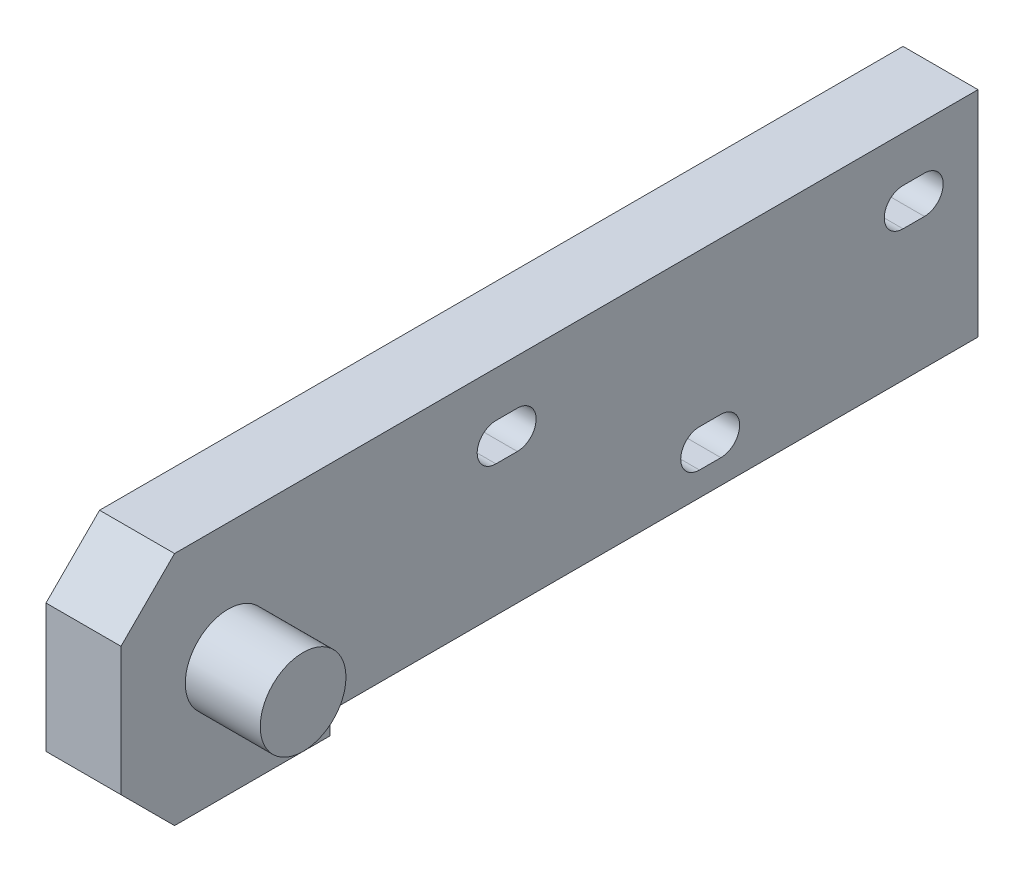
ISO-10303-21;
HEADER;
FILE_DESCRIPTION(('STEP AP214'),'2;1');
FILE_NAME('part.step','',(''),(''),'','','');
FILE_SCHEMA(('AUTOMOTIVE_DESIGN { 1 0 10303 214 1 1 1 1 }'));
ENDSEC;
DATA;
#1=APPLICATION_CONTEXT('core data for automotive mechanical design processes');
#2=APPLICATION_PROTOCOL_DEFINITION('international standard','automotive_design',2000,#1);
#3=PRODUCT_CONTEXT('',#1,'mechanical');
#4=PRODUCT('Part','Part','',(#3));
#5=PRODUCT_RELATED_PRODUCT_CATEGORY('part','',(#4));
#6=PRODUCT_DEFINITION_FORMATION('','',#4);
#7=PRODUCT_DEFINITION_CONTEXT('part definition',#1,'design');
#8=PRODUCT_DEFINITION('design','',#6,#7);
#9=PRODUCT_DEFINITION_SHAPE('','',#8);
#10=(LENGTH_UNIT() NAMED_UNIT(*) SI_UNIT(.MILLI.,.METRE.));
#11=(NAMED_UNIT(*) PLANE_ANGLE_UNIT() SI_UNIT($,.RADIAN.));
#12=(NAMED_UNIT(*) SI_UNIT($,.STERADIAN.) SOLID_ANGLE_UNIT());
#13=UNCERTAINTY_MEASURE_WITH_UNIT(LENGTH_MEASURE(1.E-05),#10,'distance_accuracy_value','');
#14=(GEOMETRIC_REPRESENTATION_CONTEXT(3) GLOBAL_UNCERTAINTY_ASSIGNED_CONTEXT((#13)) GLOBAL_UNIT_ASSIGNED_CONTEXT((#10,
#11,#12)) REPRESENTATION_CONTEXT('',''));
#15=CARTESIAN_POINT('',(0.,0.,0.));
#16=DIRECTION('',(0.,0.,1.));
#17=DIRECTION('',(1.,0.,0.));
#18=AXIS2_PLACEMENT_3D('',#15,#16,#17);
#19=CARTESIAN_POINT('',(7.,0.,10.));
#20=DIRECTION('',(0.,0.,-1.));
#21=DIRECTION('',(0.,1.,0.));
#22=AXIS2_PLACEMENT_3D('',#19,#20,#21);
#23=PLANE('',#22);
#24=DIRECTION('',(0.,-1.,0.));
#25=VECTOR('',#24,1.);
#26=CARTESIAN_POINT('',(0.,0.,10.));
#27=LINE('',#26,#25);
#28=CARTESIAN_POINT('',(0.,6.,10.));
#29=VERTEX_POINT('',#28);
#30=CARTESIAN_POINT('',(0.,-6.,10.));
#31=VERTEX_POINT('',#30);
#32=EDGE_CURVE('E246',#29,#31,#27,.T.);
#33=ORIENTED_EDGE('',*,*,#32,.T.);
#34=DIRECTION('',(-1.,0.,0.));
#35=VECTOR('',#34,1.);
#36=CARTESIAN_POINT('',(7.,-6.,10.));
#37=LINE('',#36,#35);
#38=CARTESIAN_POINT('',(7.,-6.,10.));
#39=VERTEX_POINT('',#38);
#40=EDGE_CURVE('E11',#39,#31,#37,.T.);
#41=ORIENTED_EDGE('',*,*,#40,.F.);
#42=DIRECTION('',(0.,-1.,0.));
#43=VECTOR('',#42,1.);
#44=CARTESIAN_POINT('',(7.,0.,10.));
#45=LINE('',#44,#43);
#46=CARTESIAN_POINT('',(7.,6.,10.));
#47=VERTEX_POINT('',#46);
#48=EDGE_CURVE('E344',#47,#39,#45,.T.);
#49=ORIENTED_EDGE('',*,*,#48,.F.);
#50=DIRECTION('',(-1.,0.,0.));
#51=VECTOR('',#50,1.);
#52=CARTESIAN_POINT('',(7.,6.,10.));
#53=LINE('',#52,#51);
#54=EDGE_CURVE('E264',#47,#29,#53,.T.);
#55=ORIENTED_EDGE('',*,*,#54,.T.);
#56=EDGE_LOOP('',(#33,#41,#49,#55));
#57=FACE_BOUND('',#56,.T.);
#58=ADVANCED_FACE('F39',(#57),#23,.F.);
#59=CARTESIAN_POINT('',(7.,-8.,8.));
#60=DIRECTION('',(0.,0.707106781186547,-0.707106781186548));
#61=DIRECTION('',(0.,0.707106781186548,0.707106781186547));
#62=AXIS2_PLACEMENT_3D('',#59,#60,#61);
#63=PLANE('',#62);
#64=DIRECTION('',(0.,-0.707106781186548,-0.707106781186547));
#65=VECTOR('',#64,1.);
#66=CARTESIAN_POINT('',(0.,-8.,8.));
#67=LINE('',#66,#65);
#68=CARTESIAN_POINT('',(0.,-11.,5.));
#69=VERTEX_POINT('',#68);
#70=EDGE_CURVE('E249',#31,#69,#67,.T.);
#71=ORIENTED_EDGE('',*,*,#70,.T.);
#72=DIRECTION('',(-1.,0.,0.));
#73=VECTOR('',#72,1.);
#74=CARTESIAN_POINT('',(7.,-11.,5.));
#75=LINE('',#74,#73);
#76=CARTESIAN_POINT('',(7.,-11.,5.));
#77=VERTEX_POINT('',#76);
#78=EDGE_CURVE('E49',#77,#69,#75,.T.);
#79=ORIENTED_EDGE('',*,*,#78,.F.);
#80=DIRECTION('',(0.,-0.707106781186548,-0.707106781186547));
#81=VECTOR('',#80,1.);
#82=CARTESIAN_POINT('',(7.,-8.,8.));
#83=LINE('',#82,#81);
#84=EDGE_CURVE('E346',#39,#77,#83,.T.);
#85=ORIENTED_EDGE('',*,*,#84,.F.);
#86=ORIENTED_EDGE('',*,*,#40,.T.);
#87=EDGE_LOOP('',(#71,#79,#85,#86));
#88=FACE_BOUND('',#87,.T.);
#89=ADVANCED_FACE('F377',(#88),#63,.F.);
#90=CARTESIAN_POINT('',(7.,-11.,0.));
#91=DIRECTION('',(0.,1.,0.));
#92=DIRECTION('',(0.,0.,1.));
#93=AXIS2_PLACEMENT_3D('',#90,#91,#92);
#94=PLANE('',#93);
#95=DIRECTION('',(0.,0.,-1.));
#96=VECTOR('',#95,1.);
#97=CARTESIAN_POINT('',(0.,-11.,0.));
#98=LINE('',#97,#96);
#99=CARTESIAN_POINT('',(0.,-11.,-9.50000000000001));
#100=VERTEX_POINT('',#99);
#101=EDGE_CURVE('E251',#69,#100,#98,.T.);
#102=ORIENTED_EDGE('',*,*,#101,.T.);
#103=DIRECTION('',(-1.,0.,0.));
#104=VECTOR('',#103,1.);
#105=CARTESIAN_POINT('',(7.,-11.,-9.50000000000001));
#106=LINE('',#105,#104);
#107=CARTESIAN_POINT('',(7.,-11.,-9.50000000000001));
#108=VERTEX_POINT('',#107);
#109=EDGE_CURVE('E271',#108,#100,#106,.T.);
#110=ORIENTED_EDGE('',*,*,#109,.F.);
#111=DIRECTION('',(0.,0.,-1.));
#112=VECTOR('',#111,1.);
#113=CARTESIAN_POINT('',(7.,-11.,0.));
#114=LINE('',#113,#112);
#115=EDGE_CURVE('E348',#77,#108,#114,.T.);
#116=ORIENTED_EDGE('',*,*,#115,.F.);
#117=ORIENTED_EDGE('',*,*,#78,.T.);
#118=EDGE_LOOP('',(#102,#110,#116,#117));
#119=FACE_BOUND('',#118,.T.);
#120=ADVANCED_FACE('F382',(#119),#94,.F.);
#121=CARTESIAN_POINT('',(7.,0.,-9.50000000000001));
#122=DIRECTION('',(0.,0.,1.));
#123=DIRECTION('',(1.,0.,0.));
#124=AXIS2_PLACEMENT_3D('',#121,#122,#123);
#125=PLANE('',#124);
#126=DIRECTION('',(0.,1.,0.));
#127=VECTOR('',#126,1.);
#128=CARTESIAN_POINT('',(0.,0.,-9.50000000000001));
#129=LINE('',#128,#127);
#130=CARTESIAN_POINT('',(0.,-9.00000000000001,-9.50000000000001));
#131=VERTEX_POINT('',#130);
#132=EDGE_CURVE('E253',#100,#131,#129,.T.);
#133=ORIENTED_EDGE('',*,*,#132,.T.);
#134=DIRECTION('',(-1.,0.,0.));
#135=VECTOR('',#134,1.);
#136=CARTESIAN_POINT('',(7.,-9.00000000000001,-9.50000000000001));
#137=LINE('',#136,#135);
#138=CARTESIAN_POINT('',(7.,-9.00000000000001,-9.50000000000001));
#139=VERTEX_POINT('',#138);
#140=EDGE_CURVE('E269',#139,#131,#137,.T.);
#141=ORIENTED_EDGE('',*,*,#140,.F.);
#142=DIRECTION('',(0.,1.,0.));
#143=VECTOR('',#142,1.);
#144=CARTESIAN_POINT('',(7.,0.,-9.50000000000001));
#145=LINE('',#144,#143);
#146=EDGE_CURVE('E350',#108,#139,#145,.T.);
#147=ORIENTED_EDGE('',*,*,#146,.F.);
#148=ORIENTED_EDGE('',*,*,#109,.T.);
#149=EDGE_LOOP('',(#133,#141,#147,#148));
#150=FACE_BOUND('',#149,.T.);
#151=ADVANCED_FACE('F475',(#150),#125,.F.);
#152=CARTESIAN_POINT('',(7.,-9.00000000000001,0.));
#153=DIRECTION('',(0.,-1.,0.));
#154=DIRECTION('',(0.,0.,-1.));
#155=AXIS2_PLACEMENT_3D('',#152,#153,#154);
#156=PLANE('',#155);
#157=DIRECTION('',(0.,0.,1.));
#158=VECTOR('',#157,1.);
#159=CARTESIAN_POINT('',(0.,-9.00000000000001,0.));
#160=LINE('',#159,#158);
#161=CARTESIAN_POINT('',(0.,-9.,-70.));
#162=VERTEX_POINT('',#161);
#163=EDGE_CURVE('E256',#162,#131,#160,.T.);
#164=ORIENTED_EDGE('',*,*,#163,.F.);
#165=DIRECTION('',(-1.,0.,0.));
#166=VECTOR('',#165,1.);
#167=CARTESIAN_POINT('',(7.,-9.,-70.));
#168=LINE('',#167,#166);
#169=CARTESIAN_POINT('',(7.,-9.,-70.));
#170=VERTEX_POINT('',#169);
#171=EDGE_CURVE('E195',#170,#162,#168,.T.);
#172=ORIENTED_EDGE('',*,*,#171,.F.);
#173=DIRECTION('',(0.,0.,1.));
#174=VECTOR('',#173,1.);
#175=CARTESIAN_POINT('',(7.,-9.00000000000001,0.));
#176=LINE('',#175,#174);
#177=EDGE_CURVE('E201',#170,#139,#176,.T.);
#178=ORIENTED_EDGE('',*,*,#177,.T.);
#179=ORIENTED_EDGE('',*,*,#140,.T.);
#180=EDGE_LOOP('',(#164,#172,#178,#179));
#181=FACE_BOUND('',#180,.T.);
#182=ADVANCED_FACE('F353',(#181),#156,.T.);
#183=CARTESIAN_POINT('',(7.,0.,-70.));
#184=DIRECTION('',(0.,0.,-1.));
#185=DIRECTION('',(-1.,0.,0.));
#186=AXIS2_PLACEMENT_3D('',#183,#184,#185);
#187=PLANE('',#186);
#188=DIRECTION('',(0.,-1.,0.));
#189=VECTOR('',#188,1.);
#190=CARTESIAN_POINT('',(0.,0.,-70.));
#191=LINE('',#190,#189);
#192=CARTESIAN_POINT('',(0.,11.,-70.));
#193=VERTEX_POINT('',#192);
#194=EDGE_CURVE('E190',#193,#162,#191,.T.);
#195=ORIENTED_EDGE('',*,*,#194,.F.);
#196=DIRECTION('',(-1.,0.,0.));
#197=VECTOR('',#196,1.);
#198=CARTESIAN_POINT('',(7.,11.,-70.));
#199=LINE('',#198,#197);
#200=CARTESIAN_POINT('',(7.,11.,-70.));
#201=VERTEX_POINT('',#200);
#202=EDGE_CURVE('E185',#201,#193,#199,.T.);
#203=ORIENTED_EDGE('',*,*,#202,.F.);
#204=DIRECTION('',(0.,-1.,0.));
#205=VECTOR('',#204,1.);
#206=CARTESIAN_POINT('',(7.,0.,-70.));
#207=LINE('',#206,#205);
#208=EDGE_CURVE('E188',#201,#170,#207,.T.);
#209=ORIENTED_EDGE('',*,*,#208,.T.);
#210=ORIENTED_EDGE('',*,*,#171,.T.);
#211=EDGE_LOOP('',(#195,#203,#209,#210));
#212=FACE_BOUND('',#211,.T.);
#213=ADVANCED_FACE('F187',(#212),#187,.T.);
#214=CARTESIAN_POINT('',(7.,11.,0.));
#215=DIRECTION('',(0.,1.,0.));
#216=DIRECTION('',(0.,0.,1.));
#217=AXIS2_PLACEMENT_3D('',#214,#215,#216);
#218=PLANE('',#217);
#219=DIRECTION('',(0.,0.,-1.));
#220=VECTOR('',#219,1.);
#221=CARTESIAN_POINT('',(0.,11.,0.));
#222=LINE('',#221,#220);
#223=CARTESIAN_POINT('',(0.,11.,5.));
#224=VERTEX_POINT('',#223);
#225=EDGE_CURVE('E260',#224,#193,#222,.T.);
#226=ORIENTED_EDGE('',*,*,#225,.F.);
#227=DIRECTION('',(-1.,0.,0.));
#228=VECTOR('',#227,1.);
#229=CARTESIAN_POINT('',(7.,11.,5.));
#230=LINE('',#229,#228);
#231=CARTESIAN_POINT('',(7.,11.,5.));
#232=VERTEX_POINT('',#231);
#233=EDGE_CURVE('E122',#232,#224,#230,.T.);
#234=ORIENTED_EDGE('',*,*,#233,.F.);
#235=DIRECTION('',(0.,0.,-1.));
#236=VECTOR('',#235,1.);
#237=CARTESIAN_POINT('',(7.,11.,0.));
#238=LINE('',#237,#236);
#239=EDGE_CURVE('E199',#232,#201,#238,.T.);
#240=ORIENTED_EDGE('',*,*,#239,.T.);
#241=ORIENTED_EDGE('',*,*,#202,.T.);
#242=EDGE_LOOP('',(#226,#234,#240,#241));
#243=FACE_BOUND('',#242,.T.);
#244=ADVANCED_FACE('F203',(#243),#218,.T.);
#245=CARTESIAN_POINT('',(7.,5.,-27.));
#246=DIRECTION('',(-1.,0.,0.));
#247=DIRECTION('',(0.,0.,1.));
#248=AXIS2_PLACEMENT_3D('',#245,#246,#247);
#249=CYLINDRICAL_SURFACE('',#248,1.75);
#250=CARTESIAN_POINT('',(0.,5.,-27.));
#251=DIRECTION('',(1.,0.,0.));
#252=DIRECTION('',(0.,0.,-1.));
#253=AXIS2_PLACEMENT_3D('',#250,#251,#252);
#254=CIRCLE('',#253,1.75);
#255=CARTESIAN_POINT('',(0.,3.25000000000001,-27.));
#256=VERTEX_POINT('',#255);
#257=CARTESIAN_POINT('',(0.,6.75,-27.));
#258=VERTEX_POINT('',#257);
#259=EDGE_CURVE('E234',#256,#258,#254,.T.);
#260=ORIENTED_EDGE('',*,*,#259,.F.);
#261=DIRECTION('',(-1.,0.,0.));
#262=VECTOR('',#261,1.);
#263=CARTESIAN_POINT('',(7.,3.25000000000001,-27.));
#264=LINE('',#263,#262);
#265=CARTESIAN_POINT('',(7.,3.25000000000001,-27.));
#266=VERTEX_POINT('',#265);
#267=EDGE_CURVE('E266',#266,#256,#264,.T.);
#268=ORIENTED_EDGE('',*,*,#267,.F.);
#269=CARTESIAN_POINT('',(7.,5.,-27.));
#270=DIRECTION('',(1.,0.,0.));
#271=DIRECTION('',(0.,0.,-1.));
#272=AXIS2_PLACEMENT_3D('',#269,#270,#271);
#273=CIRCLE('',#272,1.75);
#274=CARTESIAN_POINT('',(7.,6.75,-27.));
#275=VERTEX_POINT('',#274);
#276=EDGE_CURVE('E333',#266,#275,#273,.T.);
#277=ORIENTED_EDGE('',*,*,#276,.T.);
#278=DIRECTION('',(-1.,0.,0.));
#279=VECTOR('',#278,1.);
#280=CARTESIAN_POINT('',(7.,6.75,-27.));
#281=LINE('',#280,#279);
#282=EDGE_CURVE('E276',#275,#258,#281,.T.);
#283=ORIENTED_EDGE('',*,*,#282,.T.);
#284=EDGE_LOOP('',(#260,#268,#277,#283));
#285=FACE_BOUND('',#284,.T.);
#286=ADVANCED_FACE('F399',(#285),#249,.F.);
#287=CARTESIAN_POINT('',(7.,3.25,0.));
#288=DIRECTION('',(0.,1.,0.));
#289=DIRECTION('',(0.,0.,1.));
#290=AXIS2_PLACEMENT_3D('',#287,#288,#289);
#291=PLANE('',#290);
#292=DIRECTION('',(0.,0.,-1.));
#293=VECTOR('',#292,1.);
#294=CARTESIAN_POINT('',(0.,3.25,0.));
#295=LINE('',#294,#293);
#296=CARTESIAN_POINT('',(0.,3.25000000000001,-25.));
#297=VERTEX_POINT('',#296);
#298=EDGE_CURVE('E237',#297,#256,#295,.T.);
#299=ORIENTED_EDGE('',*,*,#298,.F.);
#300=DIRECTION('',(-1.,0.,0.));
#301=VECTOR('',#300,1.);
#302=CARTESIAN_POINT('',(7.,3.25000000000001,-25.));
#303=LINE('',#302,#301);
#304=CARTESIAN_POINT('',(7.,3.25000000000001,-25.));
#305=VERTEX_POINT('',#304);
#306=EDGE_CURVE('E281',#305,#297,#303,.T.);
#307=ORIENTED_EDGE('',*,*,#306,.F.);
#308=DIRECTION('',(0.,0.,-1.));
#309=VECTOR('',#308,1.);
#310=CARTESIAN_POINT('',(7.,3.25,0.));
#311=LINE('',#310,#309);
#312=EDGE_CURVE('E336',#305,#266,#311,.T.);
#313=ORIENTED_EDGE('',*,*,#312,.T.);
#314=ORIENTED_EDGE('',*,*,#267,.T.);
#315=EDGE_LOOP('',(#299,#307,#313,#314));
#316=FACE_BOUND('',#315,.T.);
#317=ADVANCED_FACE('F395',(#316),#291,.T.);
#318=CARTESIAN_POINT('',(7.,5.00000000000001,-25.));
#319=DIRECTION('',(-1.,0.,0.));
#320=DIRECTION('',(0.,0.,1.));
#321=AXIS2_PLACEMENT_3D('',#318,#319,#320);
#322=CYLINDRICAL_SURFACE('',#321,1.75);
#323=CARTESIAN_POINT('',(0.,5.00000000000001,-25.));
#324=DIRECTION('',(1.,0.,0.));
#325=DIRECTION('',(0.,0.,-1.));
#326=AXIS2_PLACEMENT_3D('',#323,#324,#325);
#327=CIRCLE('',#326,1.75);
#328=CARTESIAN_POINT('',(0.,6.75000000000001,-25.));
#329=VERTEX_POINT('',#328);
#330=EDGE_CURVE('E240',#329,#297,#327,.T.);
#331=ORIENTED_EDGE('',*,*,#330,.F.);
#332=DIRECTION('',(-1.,0.,0.));
#333=VECTOR('',#332,1.);
#334=CARTESIAN_POINT('',(7.,6.75000000000001,-25.));
#335=LINE('',#334,#333);
#336=CARTESIAN_POINT('',(7.,6.75000000000001,-25.));
#337=VERTEX_POINT('',#336);
#338=EDGE_CURVE('E278',#337,#329,#335,.T.);
#339=ORIENTED_EDGE('',*,*,#338,.F.);
#340=CARTESIAN_POINT('',(7.,5.00000000000001,-25.));
#341=DIRECTION('',(1.,0.,0.));
#342=DIRECTION('',(0.,0.,-1.));
#343=AXIS2_PLACEMENT_3D('',#340,#341,#342);
#344=CIRCLE('',#343,1.75);
#345=EDGE_CURVE('E339',#337,#305,#344,.T.);
#346=ORIENTED_EDGE('',*,*,#345,.T.);
#347=ORIENTED_EDGE('',*,*,#306,.T.);
#348=EDGE_LOOP('',(#331,#339,#346,#347));
#349=FACE_BOUND('',#348,.T.);
#350=ADVANCED_FACE('F391',(#349),#322,.F.);
#351=CARTESIAN_POINT('',(7.,-5.,-46.));
#352=DIRECTION('',(-1.,0.,0.));
#353=DIRECTION('',(0.,0.,1.));
#354=AXIS2_PLACEMENT_3D('',#351,#352,#353);
#355=CYLINDRICAL_SURFACE('',#354,1.75);
#356=CARTESIAN_POINT('',(0.,-5.,-46.));
#357=DIRECTION('',(1.,0.,0.));
#358=DIRECTION('',(0.,0.,-1.));
#359=AXIS2_PLACEMENT_3D('',#356,#357,#358);
#360=CIRCLE('',#359,1.75);
#361=CARTESIAN_POINT('',(0.,-6.75,-46.));
#362=VERTEX_POINT('',#361);
#363=CARTESIAN_POINT('',(0.,-3.25,-46.));
#364=VERTEX_POINT('',#363);
#365=EDGE_CURVE('E222',#362,#364,#360,.T.);
#366=ORIENTED_EDGE('',*,*,#365,.F.);
#367=DIRECTION('',(-1.,0.,0.));
#368=VECTOR('',#367,1.);
#369=CARTESIAN_POINT('',(7.,-6.75,-46.));
#370=LINE('',#369,#368);
#371=CARTESIAN_POINT('',(7.,-6.75,-46.));
#372=VERTEX_POINT('',#371);
#373=EDGE_CURVE('E279',#372,#362,#370,.T.);
#374=ORIENTED_EDGE('',*,*,#373,.F.);
#375=CARTESIAN_POINT('',(7.,-5.,-46.));
#376=DIRECTION('',(1.,0.,0.));
#377=DIRECTION('',(0.,0.,-1.));
#378=AXIS2_PLACEMENT_3D('',#375,#376,#377);
#379=CIRCLE('',#378,1.75);
#380=CARTESIAN_POINT('',(7.,-3.25,-46.));
#381=VERTEX_POINT('',#380);
#382=EDGE_CURVE('E316',#372,#381,#379,.T.);
#383=ORIENTED_EDGE('',*,*,#382,.T.);
#384=DIRECTION('',(-1.,0.,0.));
#385=VECTOR('',#384,1.);
#386=CARTESIAN_POINT('',(7.,-3.25,-46.));
#387=LINE('',#386,#385);
#388=EDGE_CURVE('E284',#381,#364,#387,.T.);
#389=ORIENTED_EDGE('',*,*,#388,.T.);
#390=EDGE_LOOP('',(#366,#374,#383,#389));
#391=FACE_BOUND('',#390,.T.);
#392=ADVANCED_FACE('F394',(#391),#355,.F.);
#393=CARTESIAN_POINT('',(7.,-6.75,0.));
#394=DIRECTION('',(0.,1.,0.));
#395=DIRECTION('',(0.,0.,1.));
#396=AXIS2_PLACEMENT_3D('',#393,#394,#395);
#397=PLANE('',#396);
#398=DIRECTION('',(0.,0.,-1.));
#399=VECTOR('',#398,1.);
#400=CARTESIAN_POINT('',(0.,-6.75,0.));
#401=LINE('',#400,#399);
#402=CARTESIAN_POINT('',(0.,-6.75,-44.));
#403=VERTEX_POINT('',#402);
#404=EDGE_CURVE('E225',#403,#362,#401,.T.);
#405=ORIENTED_EDGE('',*,*,#404,.F.);
#406=DIRECTION('',(-1.,0.,0.));
#407=VECTOR('',#406,1.);
#408=CARTESIAN_POINT('',(7.,-6.75,-44.));
#409=LINE('',#408,#407);
#410=CARTESIAN_POINT('',(7.,-6.75,-44.));
#411=VERTEX_POINT('',#410);
#412=EDGE_CURVE('E288',#411,#403,#409,.T.);
#413=ORIENTED_EDGE('',*,*,#412,.F.);
#414=DIRECTION('',(0.,0.,-1.));
#415=VECTOR('',#414,1.);
#416=CARTESIAN_POINT('',(7.,-6.75,0.));
#417=LINE('',#416,#415);
#418=EDGE_CURVE('E325',#411,#372,#417,.T.);
#419=ORIENTED_EDGE('',*,*,#418,.T.);
#420=ORIENTED_EDGE('',*,*,#373,.T.);
#421=EDGE_LOOP('',(#405,#413,#419,#420));
#422=FACE_BOUND('',#421,.T.);
#423=ADVANCED_FACE('F410',(#422),#397,.T.);
#424=CARTESIAN_POINT('',(7.,-5.,-44.));
#425=DIRECTION('',(-1.,0.,0.));
#426=DIRECTION('',(0.,0.,1.));
#427=AXIS2_PLACEMENT_3D('',#424,#425,#426);
#428=CYLINDRICAL_SURFACE('',#427,1.75);
#429=CARTESIAN_POINT('',(0.,-5.,-44.));
#430=DIRECTION('',(1.,0.,0.));
#431=DIRECTION('',(0.,0.,-1.));
#432=AXIS2_PLACEMENT_3D('',#429,#430,#431);
#433=CIRCLE('',#432,1.75);
#434=CARTESIAN_POINT('',(0.,-3.25,-44.));
#435=VERTEX_POINT('',#434);
#436=EDGE_CURVE('E228',#435,#403,#433,.T.);
#437=ORIENTED_EDGE('',*,*,#436,.F.);
#438=DIRECTION('',(-1.,0.,0.));
#439=VECTOR('',#438,1.);
#440=CARTESIAN_POINT('',(7.,-3.25,-44.));
#441=LINE('',#440,#439);
#442=CARTESIAN_POINT('',(7.,-3.25,-44.));
#443=VERTEX_POINT('',#442);
#444=EDGE_CURVE('E286',#443,#435,#441,.T.);
#445=ORIENTED_EDGE('',*,*,#444,.F.);
#446=CARTESIAN_POINT('',(7.,-5.,-44.));
#447=DIRECTION('',(1.,0.,0.));
#448=DIRECTION('',(0.,0.,-1.));
#449=AXIS2_PLACEMENT_3D('',#446,#447,#448);
#450=CIRCLE('',#449,1.75);
#451=EDGE_CURVE('E328',#443,#411,#450,.T.);
#452=ORIENTED_EDGE('',*,*,#451,.T.);
#453=ORIENTED_EDGE('',*,*,#412,.T.);
#454=EDGE_LOOP('',(#437,#445,#452,#453));
#455=FACE_BOUND('',#454,.T.);
#456=ADVANCED_FACE('F407',(#455),#428,.F.);
#457=CARTESIAN_POINT('',(7.,5.00000000000001,-63.));
#458=DIRECTION('',(-1.,0.,0.));
#459=DIRECTION('',(0.,0.,1.));
#460=AXIS2_PLACEMENT_3D('',#457,#458,#459);
#461=CYLINDRICAL_SURFACE('',#460,1.75);
#462=CARTESIAN_POINT('',(0.,5.00000000000001,-63.));
#463=DIRECTION('',(1.,0.,0.));
#464=DIRECTION('',(0.,0.,-1.));
#465=AXIS2_PLACEMENT_3D('',#462,#463,#464);
#466=CIRCLE('',#465,1.75);
#467=CARTESIAN_POINT('',(0.,6.75000000000001,-63.));
#468=VERTEX_POINT('',#467);
#469=CARTESIAN_POINT('',(0.,3.25,-63.));
#470=VERTEX_POINT('',#469);
#471=EDGE_CURVE('E209',#468,#470,#466,.T.);
#472=ORIENTED_EDGE('',*,*,#471,.F.);
#473=DIRECTION('',(-1.,0.,0.));
#474=VECTOR('',#473,1.);
#475=CARTESIAN_POINT('',(7.,6.75000000000001,-63.));
#476=LINE('',#475,#474);
#477=CARTESIAN_POINT('',(7.,6.75000000000001,-63.));
#478=VERTEX_POINT('',#477);
#479=EDGE_CURVE('E43',#478,#468,#476,.T.);
#480=ORIENTED_EDGE('',*,*,#479,.F.);
#481=CARTESIAN_POINT('',(7.,5.00000000000001,-63.));
#482=DIRECTION('',(1.,0.,0.));
#483=DIRECTION('',(0.,0.,-1.));
#484=AXIS2_PLACEMENT_3D('',#481,#482,#483);
#485=CIRCLE('',#484,1.75);
#486=CARTESIAN_POINT('',(7.,3.25,-63.));
#487=VERTEX_POINT('',#486);
#488=EDGE_CURVE('E263',#478,#487,#485,.T.);
#489=ORIENTED_EDGE('',*,*,#488,.T.);
#490=DIRECTION('',(-1.,0.,0.));
#491=VECTOR('',#490,1.);
#492=CARTESIAN_POINT('',(7.,3.25,-63.));
#493=LINE('',#492,#491);
#494=EDGE_CURVE('E205',#487,#470,#493,.T.);
#495=ORIENTED_EDGE('',*,*,#494,.T.);
#496=EDGE_LOOP('',(#472,#480,#489,#495));
#497=FACE_BOUND('',#496,.T.);
#498=ADVANCED_FACE('F41',(#497),#461,.F.);
#499=CARTESIAN_POINT('',(7.,6.74999999999998,0.));
#500=DIRECTION('',(0.,-1.,0.));
#501=DIRECTION('',(0.,0.,-1.));
#502=AXIS2_PLACEMENT_3D('',#499,#500,#501);
#503=PLANE('',#502);
#504=DIRECTION('',(0.,0.,1.));
#505=VECTOR('',#504,1.);
#506=CARTESIAN_POINT('',(0.,6.74999999999998,0.));
#507=LINE('',#506,#505);
#508=CARTESIAN_POINT('',(0.,6.75000000000001,-65.));
#509=VERTEX_POINT('',#508);
#510=EDGE_CURVE('E212',#509,#468,#507,.T.);
#511=ORIENTED_EDGE('',*,*,#510,.F.);
#512=DIRECTION('',(-1.,0.,0.));
#513=VECTOR('',#512,1.);
#514=CARTESIAN_POINT('',(7.,6.75000000000001,-65.));
#515=LINE('',#514,#513);
#516=CARTESIAN_POINT('',(7.,6.75000000000001,-65.));
#517=VERTEX_POINT('',#516);
#518=EDGE_CURVE('E293',#517,#509,#515,.T.);
#519=ORIENTED_EDGE('',*,*,#518,.F.);
#520=DIRECTION('',(0.,0.,1.));
#521=VECTOR('',#520,1.);
#522=CARTESIAN_POINT('',(7.,6.74999999999998,0.));
#523=LINE('',#522,#521);
#524=EDGE_CURVE('E302',#517,#478,#523,.T.);
#525=ORIENTED_EDGE('',*,*,#524,.T.);
#526=ORIENTED_EDGE('',*,*,#479,.T.);
#527=EDGE_LOOP('',(#511,#519,#525,#526));
#528=FACE_BOUND('',#527,.T.);
#529=ADVANCED_FACE('F300',(#528),#503,.T.);
#530=CARTESIAN_POINT('',(7.,5.00000000000001,-65.));
#531=DIRECTION('',(-1.,0.,0.));
#532=DIRECTION('',(0.,0.,1.));
#533=AXIS2_PLACEMENT_3D('',#530,#531,#532);
#534=CYLINDRICAL_SURFACE('',#533,1.75);
#535=CARTESIAN_POINT('',(0.,5.00000000000001,-65.));
#536=DIRECTION('',(1.,0.,0.));
#537=DIRECTION('',(0.,0.,-1.));
#538=AXIS2_PLACEMENT_3D('',#535,#536,#537);
#539=CIRCLE('',#538,1.75);
#540=CARTESIAN_POINT('',(0.,3.25,-65.));
#541=VERTEX_POINT('',#540);
#542=EDGE_CURVE('E216',#541,#509,#539,.T.);
#543=ORIENTED_EDGE('',*,*,#542,.F.);
#544=DIRECTION('',(-1.,0.,0.));
#545=VECTOR('',#544,1.);
#546=CARTESIAN_POINT('',(7.,3.25,-65.));
#547=LINE('',#546,#545);
#548=CARTESIAN_POINT('',(7.,3.25,-65.));
#549=VERTEX_POINT('',#548);
#550=EDGE_CURVE('E292',#549,#541,#547,.T.);
#551=ORIENTED_EDGE('',*,*,#550,.F.);
#552=CARTESIAN_POINT('',(7.,5.00000000000001,-65.));
#553=DIRECTION('',(1.,0.,0.));
#554=DIRECTION('',(0.,0.,-1.));
#555=AXIS2_PLACEMENT_3D('',#552,#553,#554);
#556=CIRCLE('',#555,1.75);
#557=EDGE_CURVE('E311',#549,#517,#556,.T.);
#558=ORIENTED_EDGE('',*,*,#557,.T.);
#559=ORIENTED_EDGE('',*,*,#518,.T.);
#560=EDGE_LOOP('',(#543,#551,#558,#559));
#561=FACE_BOUND('',#560,.T.);
#562=ADVANCED_FACE('F308',(#561),#534,.F.);
#563=CARTESIAN_POINT('',(7.,6.75000000000005,0.));
#564=DIRECTION('',(0.,1.,0.));
#565=DIRECTION('',(0.,0.,1.));
#566=AXIS2_PLACEMENT_3D('',#563,#564,#565);
#567=PLANE('',#566);
#568=DIRECTION('',(0.,0.,-1.));
#569=VECTOR('',#568,1.);
#570=CARTESIAN_POINT('',(0.,6.75000000000005,0.));
#571=LINE('',#570,#569);
#572=EDGE_CURVE('E243',#329,#258,#571,.T.);
#573=ORIENTED_EDGE('',*,*,#572,.T.);
#574=ORIENTED_EDGE('',*,*,#282,.F.);
#575=DIRECTION('',(0.,0.,-1.));
#576=VECTOR('',#575,1.);
#577=CARTESIAN_POINT('',(7.,6.75000000000005,0.));
#578=LINE('',#577,#576);
#579=EDGE_CURVE('E342',#337,#275,#578,.T.);
#580=ORIENTED_EDGE('',*,*,#579,.F.);
#581=ORIENTED_EDGE('',*,*,#338,.T.);
#582=EDGE_LOOP('',(#573,#574,#580,#581));
#583=FACE_BOUND('',#582,.T.);
#584=ADVANCED_FACE('F387',(#583),#567,.F.);
#585=CARTESIAN_POINT('',(7.,-3.25000000000001,0.));
#586=DIRECTION('',(0.,1.,0.));
#587=DIRECTION('',(0.,0.,1.));
#588=AXIS2_PLACEMENT_3D('',#585,#586,#587);
#589=PLANE('',#588);
#590=DIRECTION('',(0.,0.,-1.));
#591=VECTOR('',#590,1.);
#592=CARTESIAN_POINT('',(0.,-3.25000000000001,0.));
#593=LINE('',#592,#591);
#594=EDGE_CURVE('E231',#435,#364,#593,.T.);
#595=ORIENTED_EDGE('',*,*,#594,.T.);
#596=ORIENTED_EDGE('',*,*,#388,.F.);
#597=DIRECTION('',(0.,0.,-1.));
#598=VECTOR('',#597,1.);
#599=CARTESIAN_POINT('',(7.,-3.25000000000001,0.));
#600=LINE('',#599,#598);
#601=EDGE_CURVE('E331',#443,#381,#600,.T.);
#602=ORIENTED_EDGE('',*,*,#601,.F.);
#603=ORIENTED_EDGE('',*,*,#444,.T.);
#604=EDGE_LOOP('',(#595,#596,#602,#603));
#605=FACE_BOUND('',#604,.T.);
#606=ADVANCED_FACE('F372',(#605),#589,.F.);
#607=CARTESIAN_POINT('',(7.,3.24999999999999,0.));
#608=DIRECTION('',(0.,-1.,0.));
#609=DIRECTION('',(0.,0.,-1.));
#610=AXIS2_PLACEMENT_3D('',#607,#608,#609);
#611=PLANE('',#610);
#612=DIRECTION('',(0.,0.,1.));
#613=VECTOR('',#612,1.);
#614=CARTESIAN_POINT('',(0.,3.24999999999999,0.));
#615=LINE('',#614,#613);
#616=EDGE_CURVE('E219',#541,#470,#615,.T.);
#617=ORIENTED_EDGE('',*,*,#616,.T.);
#618=ORIENTED_EDGE('',*,*,#494,.F.);
#619=DIRECTION('',(0.,0.,1.));
#620=VECTOR('',#619,1.);
#621=CARTESIAN_POINT('',(7.,3.24999999999999,0.));
#622=LINE('',#621,#620);
#623=EDGE_CURVE('E313',#549,#487,#622,.T.);
#624=ORIENTED_EDGE('',*,*,#623,.F.);
#625=ORIENTED_EDGE('',*,*,#550,.T.);
#626=EDGE_LOOP('',(#617,#618,#624,#625));
#627=FACE_BOUND('',#626,.T.);
#628=ADVANCED_FACE('F314',(#627),#611,.F.);
#629=CARTESIAN_POINT('',(7.,8.,8.00000000000001));
#630=DIRECTION('',(0.,-0.707106781186547,-0.707106781186548));
#631=DIRECTION('',(0.,0.707106781186548,-0.707106781186547));
#632=AXIS2_PLACEMENT_3D('',#629,#630,#631);
#633=PLANE('',#632);
#634=DIRECTION('',(0.,-0.707106781186548,0.707106781186547));
#635=VECTOR('',#634,1.);
#636=CARTESIAN_POINT('',(0.,8.,8.00000000000001));
#637=LINE('',#636,#635);
#638=EDGE_CURVE('E125',#224,#29,#637,.T.);
#639=ORIENTED_EDGE('',*,*,#638,.T.);
#640=ORIENTED_EDGE('',*,*,#54,.F.);
#641=DIRECTION('',(0.,-0.707106781186548,0.707106781186547));
#642=VECTOR('',#641,1.);
#643=CARTESIAN_POINT('',(7.,8.,8.00000000000001));
#644=LINE('',#643,#642);
#645=EDGE_CURVE('E58',#232,#47,#644,.T.);
#646=ORIENTED_EDGE('',*,*,#645,.F.);
#647=ORIENTED_EDGE('',*,*,#233,.T.);
#648=EDGE_LOOP('',(#639,#640,#646,#647));
#649=FACE_BOUND('',#648,.T.);
#650=ADVANCED_FACE('F362',(#649),#633,.F.);
#651=CARTESIAN_POINT('',(7.,0.,0.));
#652=DIRECTION('',(1.,0.,0.));
#653=DIRECTION('',(0.,0.,-1.));
#654=AXIS2_PLACEMENT_3D('',#651,#652,#653);
#655=PLANE('',#654);
#656=CARTESIAN_POINT('',(7.,0.,0.));
#657=DIRECTION('',(1.,0.,0.));
#658=DIRECTION('',(0.,0.,-1.));
#659=AXIS2_PLACEMENT_3D('',#656,#657,#658);
#660=CIRCLE('',#659,4.);
#661=CARTESIAN_POINT('',(7.,0.,-4.));
#662=VERTEX_POINT('',#661);
#663=EDGE_CURVE('E578',#662,#662,#660,.T.);
#664=ORIENTED_EDGE('',*,*,#663,.F.);
#665=EDGE_LOOP('',(#664));
#666=FACE_BOUND('',#665,.T.);
#667=ORIENTED_EDGE('',*,*,#488,.F.);
#668=ORIENTED_EDGE('',*,*,#524,.F.);
#669=ORIENTED_EDGE('',*,*,#557,.F.);
#670=ORIENTED_EDGE('',*,*,#623,.T.);
#671=EDGE_LOOP('',(#667,#668,#669,#670));
#672=FACE_BOUND('',#671,.T.);
#673=ORIENTED_EDGE('',*,*,#382,.F.);
#674=ORIENTED_EDGE('',*,*,#418,.F.);
#675=ORIENTED_EDGE('',*,*,#451,.F.);
#676=ORIENTED_EDGE('',*,*,#601,.T.);
#677=EDGE_LOOP('',(#673,#674,#675,#676));
#678=FACE_BOUND('',#677,.T.);
#679=ORIENTED_EDGE('',*,*,#276,.F.);
#680=ORIENTED_EDGE('',*,*,#312,.F.);
#681=ORIENTED_EDGE('',*,*,#345,.F.);
#682=ORIENTED_EDGE('',*,*,#579,.T.);
#683=EDGE_LOOP('',(#679,#680,#681,#682));
#684=FACE_BOUND('',#683,.T.);
#685=ORIENTED_EDGE('',*,*,#48,.T.);
#686=ORIENTED_EDGE('',*,*,#84,.T.);
#687=ORIENTED_EDGE('',*,*,#115,.T.);
#688=ORIENTED_EDGE('',*,*,#146,.T.);
#689=ORIENTED_EDGE('',*,*,#177,.F.);
#690=ORIENTED_EDGE('',*,*,#208,.F.);
#691=ORIENTED_EDGE('',*,*,#239,.F.);
#692=ORIENTED_EDGE('',*,*,#645,.T.);
#693=EDGE_LOOP('',(#685,#686,#687,#688,#689,#690,#691,#692));
#694=FACE_BOUND('',#693,.T.);
#695=ADVANCED_FACE('F198',(#666,#672,#678,#684,#694),#655,.T.);
#696=CARTESIAN_POINT('',(0.,0.,0.));
#697=DIRECTION('',(1.,0.,0.));
#698=DIRECTION('',(0.,0.,-1.));
#699=AXIS2_PLACEMENT_3D('',#696,#697,#698);
#700=PLANE('',#699);
#701=ORIENTED_EDGE('',*,*,#471,.T.);
#702=ORIENTED_EDGE('',*,*,#616,.F.);
#703=ORIENTED_EDGE('',*,*,#542,.T.);
#704=ORIENTED_EDGE('',*,*,#510,.T.);
#705=EDGE_LOOP('',(#701,#702,#703,#704));
#706=FACE_BOUND('',#705,.T.);
#707=ORIENTED_EDGE('',*,*,#365,.T.);
#708=ORIENTED_EDGE('',*,*,#594,.F.);
#709=ORIENTED_EDGE('',*,*,#436,.T.);
#710=ORIENTED_EDGE('',*,*,#404,.T.);
#711=EDGE_LOOP('',(#707,#708,#709,#710));
#712=FACE_BOUND('',#711,.T.);
#713=ORIENTED_EDGE('',*,*,#259,.T.);
#714=ORIENTED_EDGE('',*,*,#572,.F.);
#715=ORIENTED_EDGE('',*,*,#330,.T.);
#716=ORIENTED_EDGE('',*,*,#298,.T.);
#717=EDGE_LOOP('',(#713,#714,#715,#716));
#718=FACE_BOUND('',#717,.T.);
#719=ORIENTED_EDGE('',*,*,#32,.F.);
#720=ORIENTED_EDGE('',*,*,#638,.F.);
#721=ORIENTED_EDGE('',*,*,#225,.T.);
#722=ORIENTED_EDGE('',*,*,#194,.T.);
#723=ORIENTED_EDGE('',*,*,#163,.T.);
#724=ORIENTED_EDGE('',*,*,#132,.F.);
#725=ORIENTED_EDGE('',*,*,#101,.F.);
#726=ORIENTED_EDGE('',*,*,#70,.F.);
#727=EDGE_LOOP('',(#719,#720,#721,#722,#723,#724,#725,#726));
#728=FACE_BOUND('',#727,.T.);
#729=ADVANCED_FACE('F306',(#706,#712,#718,#728),#700,.F.);
#730=CARTESIAN_POINT('',(14.,0.,0.));
#731=DIRECTION('',(-1.,0.,0.));
#732=DIRECTION('',(0.,0.,1.));
#733=AXIS2_PLACEMENT_3D('',#730,#731,#732);
#734=CYLINDRICAL_SURFACE('',#733,4.);
#735=CARTESIAN_POINT('',(14.,0.,0.));
#736=DIRECTION('',(1.,0.,0.));
#737=DIRECTION('',(0.,0.,-1.));
#738=AXIS2_PLACEMENT_3D('',#735,#736,#737);
#739=CIRCLE('',#738,4.);
#740=CARTESIAN_POINT('',(14.,0.,-4.));
#741=VERTEX_POINT('',#740);
#742=EDGE_CURVE('E213',#741,#741,#739,.T.);
#743=ORIENTED_EDGE('',*,*,#742,.F.);
#744=EDGE_LOOP('',(#743));
#745=FACE_BOUND('',#744,.T.);
#746=ORIENTED_EDGE('',*,*,#663,.T.);
#747=EDGE_LOOP('',(#746));
#748=FACE_BOUND('',#747,.T.);
#749=ADVANCED_FACE('F553',(#745,#748),#734,.T.);
#750=CARTESIAN_POINT('',(14.,0.,0.));
#751=DIRECTION('',(1.,0.,0.));
#752=DIRECTION('',(0.,0.,-1.));
#753=AXIS2_PLACEMENT_3D('',#750,#751,#752);
#754=PLANE('',#753);
#755=ORIENTED_EDGE('',*,*,#742,.T.);
#756=EDGE_LOOP('',(#755));
#757=FACE_BOUND('',#756,.T.);
#758=ADVANCED_FACE('F560',(#757),#754,.T.);
#759=CLOSED_SHELL('',(#58,#89,#120,#151,#182,#213,#244,#286,#317,#350,#392,#423,#456,#498,#529,
#562,#584,#606,#628,#650,#695,#729,#749,#758));
#760=MANIFOLD_SOLID_BREP('B2',#759);
#761=ADVANCED_BREP_SHAPE_REPRESENTATION('',(#18,#760),#14);
#762=SHAPE_DEFINITION_REPRESENTATION(#9,#761);
ENDSEC;
END-ISO-10303-21;
